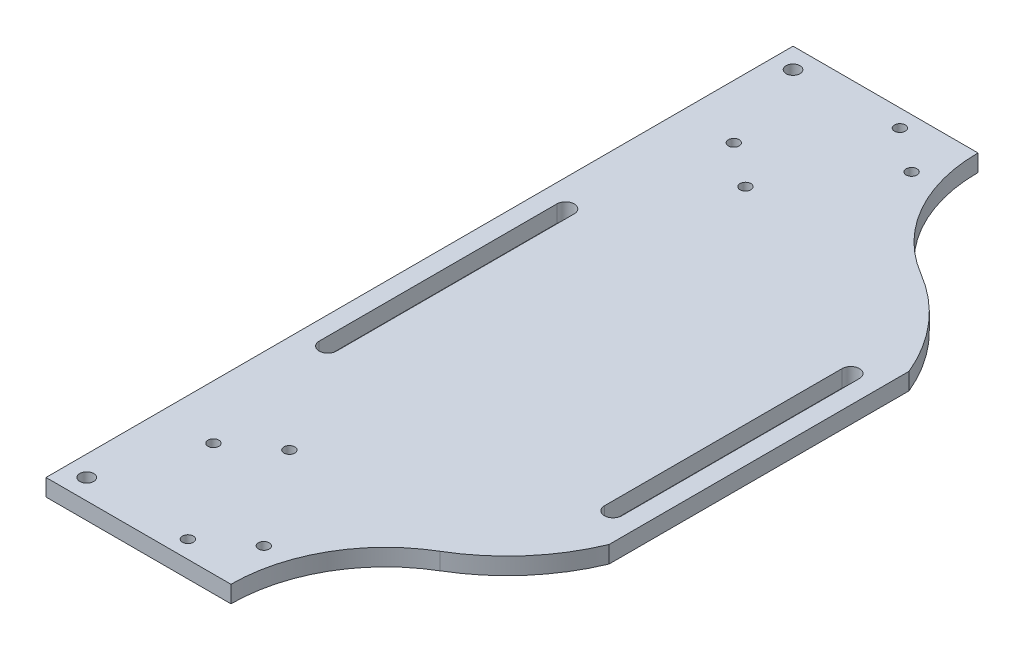
ISO-10303-21;
HEADER;
FILE_DESCRIPTION(('STEP AP214'),'2;1');
FILE_NAME('part.step','',(''),(''),'','','');
FILE_SCHEMA(('AUTOMOTIVE_DESIGN { 1 0 10303 214 1 1 1 1 }'));
ENDSEC;
DATA;
#1=APPLICATION_CONTEXT('core data for automotive mechanical design processes');
#2=APPLICATION_PROTOCOL_DEFINITION('international standard','automotive_design',2000,#1);
#3=PRODUCT_CONTEXT('',#1,'mechanical');
#4=PRODUCT('Part','Part','',(#3));
#5=PRODUCT_RELATED_PRODUCT_CATEGORY('part','',(#4));
#6=PRODUCT_DEFINITION_FORMATION('','',#4);
#7=PRODUCT_DEFINITION_CONTEXT('part definition',#1,'design');
#8=PRODUCT_DEFINITION('design','',#6,#7);
#9=PRODUCT_DEFINITION_SHAPE('','',#8);
#10=(LENGTH_UNIT() NAMED_UNIT(*) SI_UNIT(.MILLI.,.METRE.));
#11=(NAMED_UNIT(*) PLANE_ANGLE_UNIT() SI_UNIT($,.RADIAN.));
#12=(NAMED_UNIT(*) SI_UNIT($,.STERADIAN.) SOLID_ANGLE_UNIT());
#13=UNCERTAINTY_MEASURE_WITH_UNIT(LENGTH_MEASURE(1.E-05),#10,'distance_accuracy_value','');
#14=(GEOMETRIC_REPRESENTATION_CONTEXT(3) GLOBAL_UNCERTAINTY_ASSIGNED_CONTEXT((#13)) GLOBAL_UNIT_ASSIGNED_CONTEXT((#10,
#11,#12)) REPRESENTATION_CONTEXT('',''));
#15=CARTESIAN_POINT('',(0.,0.,0.));
#16=DIRECTION('',(0.,0.,1.));
#17=DIRECTION('',(1.,0.,0.));
#18=AXIS2_PLACEMENT_3D('',#15,#16,#17);
#19=CARTESIAN_POINT('',(0.,5.,0.));
#20=DIRECTION('',(0.,1.,0.));
#21=DIRECTION('',(0.,0.,1.));
#22=AXIS2_PLACEMENT_3D('',#19,#20,#21);
#23=PLANE('',#22);
#24=CARTESIAN_POINT('',(-1.59043539274804,5.,-22.6766971675435));
#25=DIRECTION('',(0.,-1.,0.));
#26=DIRECTION('',(0.,0.,-1.));
#27=AXIS2_PLACEMENT_3D('',#24,#25,#26);
#28=CIRCLE('',#27,55.8907274632713);
#29=CARTESIAN_POINT('',(26.8388547492282,5.,-70.7968476078424));
#30=VERTEX_POINT('',#29);
#31=CARTESIAN_POINT('',(50.,5.,-44.1755434705514));
#32=VERTEX_POINT('',#31);
#33=EDGE_CURVE('E171',#30,#32,#28,.T.);
#34=ORIENTED_EDGE('',*,*,#33,.F.);
#35=CARTESIAN_POINT('',(50.,5.,-110.));
#36=DIRECTION('',(0.,1.,0.));
#37=DIRECTION('',(0.,0.,1.));
#38=AXIS2_PLACEMENT_3D('',#35,#36,#37);
#39=CIRCLE('',#38,45.5337875298122);
#40=CARTESIAN_POINT('',(4.46621247018783,5.,-110.));
#41=VERTEX_POINT('',#40);
#42=EDGE_CURVE('E158',#41,#30,#39,.T.);
#43=ORIENTED_EDGE('',*,*,#42,.F.);
#44=DIRECTION('',(-1.,0.,0.));
#45=VECTOR('',#44,1.);
#46=CARTESIAN_POINT('',(50.,5.,-110.));
#47=LINE('',#46,#45);
#48=CARTESIAN_POINT('',(-50.,5.,-110.));
#49=VERTEX_POINT('',#48);
#50=EDGE_CURVE('E168',#41,#49,#47,.T.);
#51=ORIENTED_EDGE('',*,*,#50,.T.);
#52=DIRECTION('',(0.,0.,1.));
#53=VECTOR('',#52,1.);
#54=CARTESIAN_POINT('',(-50.,5.,110.));
#55=LINE('',#54,#53);
#56=CARTESIAN_POINT('',(-50.,5.,110.));
#57=VERTEX_POINT('',#56);
#58=EDGE_CURVE('E204',#49,#57,#55,.T.);
#59=ORIENTED_EDGE('',*,*,#58,.T.);
#60=DIRECTION('',(1.,0.,0.));
#61=VECTOR('',#60,1.);
#62=CARTESIAN_POINT('',(50.,5.,110.));
#63=LINE('',#62,#61);
#64=CARTESIAN_POINT('',(4.46621247018783,5.,110.));
#65=VERTEX_POINT('',#64);
#66=EDGE_CURVE('E185',#57,#65,#63,.T.);
#67=ORIENTED_EDGE('',*,*,#66,.T.);
#68=CARTESIAN_POINT('',(50.,5.,110.));
#69=DIRECTION('',(0.,1.,0.));
#70=DIRECTION('',(0.,0.,-1.));
#71=AXIS2_PLACEMENT_3D('',#68,#69,#70);
#72=CIRCLE('',#71,45.5337875298122);
#73=CARTESIAN_POINT('',(26.8388547492282,5.,70.7968476078424));
#74=VERTEX_POINT('',#73);
#75=EDGE_CURVE('E173',#74,#65,#72,.T.);
#76=ORIENTED_EDGE('',*,*,#75,.F.);
#77=CARTESIAN_POINT('',(-1.59043539274804,5.,22.6766971675435));
#78=DIRECTION('',(0.,-1.,0.));
#79=DIRECTION('',(0.,0.,1.));
#80=AXIS2_PLACEMENT_3D('',#77,#78,#79);
#81=CIRCLE('',#80,55.8907274632713);
#82=CARTESIAN_POINT('',(50.,5.,44.1755434705514));
#83=VERTEX_POINT('',#82);
#84=EDGE_CURVE('E400',#83,#74,#81,.T.);
#85=ORIENTED_EDGE('',*,*,#84,.F.);
#86=DIRECTION('',(0.,0.,-1.));
#87=VECTOR('',#86,1.);
#88=CARTESIAN_POINT('',(50.,5.,110.));
#89=LINE('',#88,#87);
#90=EDGE_CURVE('E180',#83,#32,#89,.T.);
#91=ORIENTED_EDGE('',*,*,#90,.T.);
#92=EDGE_LOOP('',(#34,#43,#51,#59,#67,#76,#85,#91));
#93=FACE_BOUND('',#92,.T.);
#94=CARTESIAN_POINT('',(-44.,5.,104.));
#95=DIRECTION('',(0.,1.,0.));
#96=DIRECTION('',(0.,0.,-1.));
#97=AXIS2_PLACEMENT_3D('',#94,#95,#96);
#98=CIRCLE('',#97,2.04999999999999);
#99=CARTESIAN_POINT('',(-44.,5.,101.95));
#100=VERTEX_POINT('',#99);
#101=EDGE_CURVE('E282',#100,#100,#98,.T.);
#102=ORIENTED_EDGE('',*,*,#101,.F.);
#103=EDGE_LOOP('',(#102));
#104=FACE_BOUND('',#103,.T.);
#105=CARTESIAN_POINT('',(-21.1703514193632,5.,67.157003263505));
#106=DIRECTION('',(0.,1.,0.));
#107=DIRECTION('',(0.,0.,-1.));
#108=AXIS2_PLACEMENT_3D('',#105,#106,#107);
#109=CIRCLE('',#108,1.60000000000001);
#110=CARTESIAN_POINT('',(-21.1703514193632,5.,65.557003263505));
#111=VERTEX_POINT('',#110);
#112=EDGE_CURVE('E298',#111,#111,#109,.T.);
#113=ORIENTED_EDGE('',*,*,#112,.F.);
#114=EDGE_LOOP('',(#113));
#115=FACE_BOUND('',#114,.T.);
#116=CARTESIAN_POINT('',(-21.1703514193632,5.,-67.157003263505));
#117=DIRECTION('',(0.,1.,0.));
#118=DIRECTION('',(0.,0.,1.));
#119=AXIS2_PLACEMENT_3D('',#116,#117,#118);
#120=CIRCLE('',#119,1.60000000000001);
#121=CARTESIAN_POINT('',(-21.1703514193632,5.,-65.557003263505));
#122=VERTEX_POINT('',#121);
#123=EDGE_CURVE('E314',#122,#122,#120,.T.);
#124=ORIENTED_EDGE('',*,*,#123,.F.);
#125=EDGE_LOOP('',(#124));
#126=FACE_BOUND('',#125,.T.);
#127=CARTESIAN_POINT('',(-34.0728313530545,5.,-76.6188218815453));
#128=DIRECTION('',(0.,1.,0.));
#129=DIRECTION('',(0.,0.,1.));
#130=AXIS2_PLACEMENT_3D('',#127,#128,#129);
#131=CIRCLE('',#130,1.6);
#132=CARTESIAN_POINT('',(-34.0728313530545,5.,-75.0188218815453));
#133=VERTEX_POINT('',#132);
#134=EDGE_CURVE('E330',#133,#133,#131,.T.);
#135=ORIENTED_EDGE('',*,*,#134,.F.);
#136=EDGE_LOOP('',(#135));
#137=FACE_BOUND('',#136,.T.);
#138=CARTESIAN_POINT('',(-44.,5.,-104.));
#139=DIRECTION('',(0.,1.,0.));
#140=DIRECTION('',(0.,0.,1.));
#141=AXIS2_PLACEMENT_3D('',#138,#139,#140);
#142=CIRCLE('',#141,2.04999999999999);
#143=CARTESIAN_POINT('',(-44.,5.,-101.95));
#144=VERTEX_POINT('',#143);
#145=EDGE_CURVE('E346',#144,#144,#142,.T.);
#146=ORIENTED_EDGE('',*,*,#145,.F.);
#147=EDGE_LOOP('',(#146));
#148=FACE_BOUND('',#147,.T.);
#149=DIRECTION('',(0.,0.,-1.));
#150=VECTOR('',#149,1.);
#151=CARTESIAN_POINT('',(44.55,5.,35.));
#152=LINE('',#151,#150);
#153=CARTESIAN_POINT('',(44.55,5.,35.));
#154=VERTEX_POINT('',#153);
#155=CARTESIAN_POINT('',(44.55,5.,-35.));
#156=VERTEX_POINT('',#155);
#157=EDGE_CURVE('E357',#154,#156,#152,.T.);
#158=ORIENTED_EDGE('',*,*,#157,.F.);
#159=CARTESIAN_POINT('',(42.,5.,35.));
#160=DIRECTION('',(0.,1.,0.));
#161=DIRECTION('',(0.,0.,1.));
#162=AXIS2_PLACEMENT_3D('',#159,#160,#161);
#163=CIRCLE('',#162,2.55000000000001);
#164=CARTESIAN_POINT('',(39.45,5.,35.));
#165=VERTEX_POINT('',#164);
#166=EDGE_CURVE('E354',#165,#154,#163,.T.);
#167=ORIENTED_EDGE('',*,*,#166,.F.);
#168=DIRECTION('',(0.,0.,1.));
#169=VECTOR('',#168,1.);
#170=CARTESIAN_POINT('',(39.45,5.,35.));
#171=LINE('',#170,#169);
#172=CARTESIAN_POINT('',(39.45,5.,-35.));
#173=VERTEX_POINT('',#172);
#174=EDGE_CURVE('E365',#173,#165,#171,.T.);
#175=ORIENTED_EDGE('',*,*,#174,.F.);
#176=CARTESIAN_POINT('',(42.,5.,-35.));
#177=DIRECTION('',(0.,1.,0.));
#178=DIRECTION('',(0.,0.,1.));
#179=AXIS2_PLACEMENT_3D('',#176,#177,#178);
#180=CIRCLE('',#179,2.55000000000001);
#181=EDGE_CURVE('E361',#156,#173,#180,.T.);
#182=ORIENTED_EDGE('',*,*,#181,.F.);
#183=EDGE_LOOP('',(#158,#167,#175,#182));
#184=FACE_BOUND('',#183,.T.);
#185=CARTESIAN_POINT('',(-0.472623192400063,5.,-95.3811781184547));
#186=DIRECTION('',(0.,1.,0.));
#187=DIRECTION('',(0.,0.,1.));
#188=AXIS2_PLACEMENT_3D('',#185,#186,#187);
#189=CIRCLE('',#188,1.60000000000001);
#190=CARTESIAN_POINT('',(-0.472623192400063,5.,-93.7811781184547));
#191=VERTEX_POINT('',#190);
#192=EDGE_CURVE('E338',#191,#191,#189,.T.);
#193=ORIENTED_EDGE('',*,*,#192,.F.);
#194=EDGE_LOOP('',(#193));
#195=FACE_BOUND('',#194,.T.);
#196=CARTESIAN_POINT('',(-0.472623192400063,5.,95.3811781184547));
#197=DIRECTION('',(0.,1.,0.));
#198=DIRECTION('',(0.,0.,-1.));
#199=AXIS2_PLACEMENT_3D('',#196,#197,#198);
#200=CIRCLE('',#199,1.60000000000001);
#201=CARTESIAN_POINT('',(-0.472623192400063,5.,93.7811781184547));
#202=VERTEX_POINT('',#201);
#203=EDGE_CURVE('E322',#202,#202,#200,.T.);
#204=ORIENTED_EDGE('',*,*,#203,.F.);
#205=EDGE_LOOP('',(#204));
#206=FACE_BOUND('',#205,.T.);
#207=CARTESIAN_POINT('',(-13.3751031260914,5.,-104.842996736495));
#208=DIRECTION('',(0.,1.,0.));
#209=DIRECTION('',(0.,0.,1.));
#210=AXIS2_PLACEMENT_3D('',#207,#208,#209);
#211=CIRCLE('',#210,1.60000000000001);
#212=CARTESIAN_POINT('',(-13.3751031260914,5.,-103.242996736495));
#213=VERTEX_POINT('',#212);
#214=EDGE_CURVE('E306',#213,#213,#211,.T.);
#215=ORIENTED_EDGE('',*,*,#214,.F.);
#216=EDGE_LOOP('',(#215));
#217=FACE_BOUND('',#216,.T.);
#218=CARTESIAN_POINT('',(-34.0728313530545,5.,76.6188218815453));
#219=DIRECTION('',(0.,1.,0.));
#220=DIRECTION('',(0.,0.,-1.));
#221=AXIS2_PLACEMENT_3D('',#218,#219,#220);
#222=CIRCLE('',#221,1.6);
#223=CARTESIAN_POINT('',(-34.0728313530545,5.,75.0188218815453));
#224=VERTEX_POINT('',#223);
#225=EDGE_CURVE('E290',#224,#224,#222,.T.);
#226=ORIENTED_EDGE('',*,*,#225,.F.);
#227=EDGE_LOOP('',(#226));
#228=FACE_BOUND('',#227,.T.);
#229=CARTESIAN_POINT('',(-13.3751031260914,5.,104.842996736495));
#230=DIRECTION('',(0.,1.,0.));
#231=DIRECTION('',(0.,0.,-1.));
#232=AXIS2_PLACEMENT_3D('',#229,#230,#231);
#233=CIRCLE('',#232,1.60000000000001);
#234=CARTESIAN_POINT('',(-13.3751031260914,5.,103.242996736495));
#235=VERTEX_POINT('',#234);
#236=EDGE_CURVE('E274',#235,#235,#233,.T.);
#237=ORIENTED_EDGE('',*,*,#236,.F.);
#238=EDGE_LOOP('',(#237));
#239=FACE_BOUND('',#238,.T.);
#240=DIRECTION('',(0.,0.,-1.));
#241=VECTOR('',#240,1.);
#242=CARTESIAN_POINT('',(-39.45,5.,35.));
#243=LINE('',#242,#241);
#244=CARTESIAN_POINT('',(-39.45,5.,35.));
#245=VERTEX_POINT('',#244);
#246=CARTESIAN_POINT('',(-39.45,5.,-35.));
#247=VERTEX_POINT('',#246);
#248=EDGE_CURVE('E238',#245,#247,#243,.T.);
#249=ORIENTED_EDGE('',*,*,#248,.F.);
#250=CARTESIAN_POINT('',(-42.,5.,35.));
#251=DIRECTION('',(0.,1.,0.));
#252=DIRECTION('',(0.,0.,-1.));
#253=AXIS2_PLACEMENT_3D('',#250,#251,#252);
#254=CIRCLE('',#253,2.55000000000001);
#255=CARTESIAN_POINT('',(-44.55,5.,35.));
#256=VERTEX_POINT('',#255);
#257=EDGE_CURVE('E235',#256,#245,#254,.T.);
#258=ORIENTED_EDGE('',*,*,#257,.F.);
#259=DIRECTION('',(0.,0.,1.));
#260=VECTOR('',#259,1.);
#261=CARTESIAN_POINT('',(-44.55,5.,35.));
#262=LINE('',#261,#260);
#263=CARTESIAN_POINT('',(-44.55,5.,-35.));
#264=VERTEX_POINT('',#263);
#265=EDGE_CURVE('E246',#264,#256,#262,.T.);
#266=ORIENTED_EDGE('',*,*,#265,.F.);
#267=CARTESIAN_POINT('',(-42.,5.,-35.));
#268=DIRECTION('',(0.,1.,0.));
#269=DIRECTION('',(0.,0.,-1.));
#270=AXIS2_PLACEMENT_3D('',#267,#268,#269);
#271=CIRCLE('',#270,2.55000000000001);
#272=EDGE_CURVE('E242',#247,#264,#271,.T.);
#273=ORIENTED_EDGE('',*,*,#272,.F.);
#274=EDGE_LOOP('',(#249,#258,#266,#273));
#275=FACE_BOUND('',#274,.T.);
#276=ADVANCED_FACE('F43',(#93,#104,#115,#126,#137,#148,#184,#195,#206,#217,#228,#239,#275),#23,.T.);
#277=CARTESIAN_POINT('',(0.,0.,0.));
#278=DIRECTION('',(0.,1.,0.));
#279=DIRECTION('',(0.,0.,1.));
#280=AXIS2_PLACEMENT_3D('',#277,#278,#279);
#281=PLANE('',#280);
#282=CARTESIAN_POINT('',(-13.3751031260914,0.,104.842996736495));
#283=DIRECTION('',(0.,1.,0.));
#284=DIRECTION('',(0.,0.,-1.));
#285=AXIS2_PLACEMENT_3D('',#282,#283,#284);
#286=CIRCLE('',#285,1.60000000000001);
#287=CARTESIAN_POINT('',(-13.3751031260914,0.,103.242996736495));
#288=VERTEX_POINT('',#287);
#289=EDGE_CURVE('E273',#288,#288,#286,.T.);
#290=ORIENTED_EDGE('',*,*,#289,.T.);
#291=EDGE_LOOP('',(#290));
#292=FACE_BOUND('',#291,.T.);
#293=CARTESIAN_POINT('',(-44.,0.,104.));
#294=DIRECTION('',(0.,1.,0.));
#295=DIRECTION('',(0.,0.,-1.));
#296=AXIS2_PLACEMENT_3D('',#293,#294,#295);
#297=CIRCLE('',#296,2.04999999999999);
#298=CARTESIAN_POINT('',(-44.,0.,101.95));
#299=VERTEX_POINT('',#298);
#300=EDGE_CURVE('E278',#299,#299,#297,.T.);
#301=ORIENTED_EDGE('',*,*,#300,.T.);
#302=EDGE_LOOP('',(#301));
#303=FACE_BOUND('',#302,.T.);
#304=CARTESIAN_POINT('',(-34.0728313530545,0.,76.6188218815453));
#305=DIRECTION('',(0.,1.,0.));
#306=DIRECTION('',(0.,0.,-1.));
#307=AXIS2_PLACEMENT_3D('',#304,#305,#306);
#308=CIRCLE('',#307,1.6);
#309=CARTESIAN_POINT('',(-34.0728313530545,0.,75.0188218815453));
#310=VERTEX_POINT('',#309);
#311=EDGE_CURVE('E286',#310,#310,#308,.T.);
#312=ORIENTED_EDGE('',*,*,#311,.T.);
#313=EDGE_LOOP('',(#312));
#314=FACE_BOUND('',#313,.T.);
#315=CARTESIAN_POINT('',(-21.1703514193632,0.,67.157003263505));
#316=DIRECTION('',(0.,1.,0.));
#317=DIRECTION('',(0.,0.,-1.));
#318=AXIS2_PLACEMENT_3D('',#315,#316,#317);
#319=CIRCLE('',#318,1.60000000000001);
#320=CARTESIAN_POINT('',(-21.1703514193632,0.,65.557003263505));
#321=VERTEX_POINT('',#320);
#322=EDGE_CURVE('E294',#321,#321,#319,.T.);
#323=ORIENTED_EDGE('',*,*,#322,.T.);
#324=EDGE_LOOP('',(#323));
#325=FACE_BOUND('',#324,.T.);
#326=CARTESIAN_POINT('',(-13.3751031260914,0.,-104.842996736495));
#327=DIRECTION('',(0.,1.,0.));
#328=DIRECTION('',(0.,0.,1.));
#329=AXIS2_PLACEMENT_3D('',#326,#327,#328);
#330=CIRCLE('',#329,1.60000000000001);
#331=CARTESIAN_POINT('',(-13.3751031260914,0.,-103.242996736495));
#332=VERTEX_POINT('',#331);
#333=EDGE_CURVE('E302',#332,#332,#330,.T.);
#334=ORIENTED_EDGE('',*,*,#333,.T.);
#335=EDGE_LOOP('',(#334));
#336=FACE_BOUND('',#335,.T.);
#337=CARTESIAN_POINT('',(-21.1703514193632,0.,-67.157003263505));
#338=DIRECTION('',(0.,1.,0.));
#339=DIRECTION('',(0.,0.,1.));
#340=AXIS2_PLACEMENT_3D('',#337,#338,#339);
#341=CIRCLE('',#340,1.60000000000001);
#342=CARTESIAN_POINT('',(-21.1703514193632,0.,-65.557003263505));
#343=VERTEX_POINT('',#342);
#344=EDGE_CURVE('E310',#343,#343,#341,.T.);
#345=ORIENTED_EDGE('',*,*,#344,.T.);
#346=EDGE_LOOP('',(#345));
#347=FACE_BOUND('',#346,.T.);
#348=CARTESIAN_POINT('',(-0.472623192400063,0.,95.3811781184547));
#349=DIRECTION('',(0.,1.,0.));
#350=DIRECTION('',(0.,0.,-1.));
#351=AXIS2_PLACEMENT_3D('',#348,#349,#350);
#352=CIRCLE('',#351,1.60000000000001);
#353=CARTESIAN_POINT('',(-0.472623192400063,0.,93.7811781184547));
#354=VERTEX_POINT('',#353);
#355=EDGE_CURVE('E318',#354,#354,#352,.T.);
#356=ORIENTED_EDGE('',*,*,#355,.T.);
#357=EDGE_LOOP('',(#356));
#358=FACE_BOUND('',#357,.T.);
#359=CARTESIAN_POINT('',(-34.0728313530545,0.,-76.6188218815453));
#360=DIRECTION('',(0.,1.,0.));
#361=DIRECTION('',(0.,0.,1.));
#362=AXIS2_PLACEMENT_3D('',#359,#360,#361);
#363=CIRCLE('',#362,1.6);
#364=CARTESIAN_POINT('',(-34.0728313530545,0.,-75.0188218815453));
#365=VERTEX_POINT('',#364);
#366=EDGE_CURVE('E326',#365,#365,#363,.T.);
#367=ORIENTED_EDGE('',*,*,#366,.T.);
#368=EDGE_LOOP('',(#367));
#369=FACE_BOUND('',#368,.T.);
#370=CARTESIAN_POINT('',(-0.472623192400063,0.,-95.3811781184547));
#371=DIRECTION('',(0.,1.,0.));
#372=DIRECTION('',(0.,0.,1.));
#373=AXIS2_PLACEMENT_3D('',#370,#371,#372);
#374=CIRCLE('',#373,1.60000000000001);
#375=CARTESIAN_POINT('',(-0.472623192400063,0.,-93.7811781184547));
#376=VERTEX_POINT('',#375);
#377=EDGE_CURVE('E334',#376,#376,#374,.T.);
#378=ORIENTED_EDGE('',*,*,#377,.T.);
#379=EDGE_LOOP('',(#378));
#380=FACE_BOUND('',#379,.T.);
#381=CARTESIAN_POINT('',(-44.,0.,-104.));
#382=DIRECTION('',(0.,1.,0.));
#383=DIRECTION('',(0.,0.,1.));
#384=AXIS2_PLACEMENT_3D('',#381,#382,#383);
#385=CIRCLE('',#384,2.04999999999999);
#386=CARTESIAN_POINT('',(-44.,0.,-101.95));
#387=VERTEX_POINT('',#386);
#388=EDGE_CURVE('E342',#387,#387,#385,.T.);
#389=ORIENTED_EDGE('',*,*,#388,.T.);
#390=EDGE_LOOP('',(#389));
#391=FACE_BOUND('',#390,.T.);
#392=CARTESIAN_POINT('',(42.,0.,35.));
#393=DIRECTION('',(0.,1.,0.));
#394=DIRECTION('',(0.,0.,1.));
#395=AXIS2_PLACEMENT_3D('',#392,#393,#394);
#396=CIRCLE('',#395,2.55000000000001);
#397=CARTESIAN_POINT('',(39.45,0.,35.));
#398=VERTEX_POINT('',#397);
#399=CARTESIAN_POINT('',(44.55,0.,35.));
#400=VERTEX_POINT('',#399);
#401=EDGE_CURVE('E350',#398,#400,#396,.T.);
#402=ORIENTED_EDGE('',*,*,#401,.T.);
#403=DIRECTION('',(0.,0.,-1.));
#404=VECTOR('',#403,1.);
#405=CARTESIAN_POINT('',(44.55,0.,35.));
#406=LINE('',#405,#404);
#407=CARTESIAN_POINT('',(44.55,0.,-35.));
#408=VERTEX_POINT('',#407);
#409=EDGE_CURVE('E372',#400,#408,#406,.T.);
#410=ORIENTED_EDGE('',*,*,#409,.T.);
#411=CARTESIAN_POINT('',(42.,0.,-35.));
#412=DIRECTION('',(0.,1.,0.));
#413=DIRECTION('',(0.,0.,1.));
#414=AXIS2_PLACEMENT_3D('',#411,#412,#413);
#415=CIRCLE('',#414,2.55000000000001);
#416=CARTESIAN_POINT('',(39.45,0.,-35.));
#417=VERTEX_POINT('',#416);
#418=EDGE_CURVE('E376',#408,#417,#415,.T.);
#419=ORIENTED_EDGE('',*,*,#418,.T.);
#420=DIRECTION('',(0.,0.,1.));
#421=VECTOR('',#420,1.);
#422=CARTESIAN_POINT('',(39.45,0.,35.));
#423=LINE('',#422,#421);
#424=EDGE_CURVE('E358',#417,#398,#423,.T.);
#425=ORIENTED_EDGE('',*,*,#424,.T.);
#426=EDGE_LOOP('',(#402,#410,#419,#425));
#427=FACE_BOUND('',#426,.T.);
#428=CARTESIAN_POINT('',(50.,0.,-110.));
#429=DIRECTION('',(0.,1.,0.));
#430=DIRECTION('',(0.,0.,1.));
#431=AXIS2_PLACEMENT_3D('',#428,#429,#430);
#432=CIRCLE('',#431,45.5337875298122);
#433=CARTESIAN_POINT('',(4.46621247018782,0.,-110.));
#434=VERTEX_POINT('',#433);
#435=CARTESIAN_POINT('',(26.8388547492282,0.,-70.7968476078424));
#436=VERTEX_POINT('',#435);
#437=EDGE_CURVE('E66',#434,#436,#432,.T.);
#438=ORIENTED_EDGE('',*,*,#437,.T.);
#439=CARTESIAN_POINT('',(-1.59043539274804,0.,-22.6766971675435));
#440=DIRECTION('',(0.,1.,0.));
#441=DIRECTION('',(0.,0.,1.));
#442=AXIS2_PLACEMENT_3D('',#439,#440,#441);
#443=CIRCLE('',#442,55.8907274632713);
#444=CARTESIAN_POINT('',(50.,0.,-44.1755434705514));
#445=VERTEX_POINT('',#444);
#446=EDGE_CURVE('E224',#436,#445,#443,.F.);
#447=ORIENTED_EDGE('',*,*,#446,.T.);
#448=DIRECTION('',(0.,0.,-1.));
#449=VECTOR('',#448,1.);
#450=CARTESIAN_POINT('',(50.,0.,110.));
#451=LINE('',#450,#449);
#452=CARTESIAN_POINT('',(50.,0.,44.1755434705514));
#453=VERTEX_POINT('',#452);
#454=EDGE_CURVE('E198',#453,#445,#451,.T.);
#455=ORIENTED_EDGE('',*,*,#454,.F.);
#456=CARTESIAN_POINT('',(-1.59043539274804,0.,22.6766971675435));
#457=DIRECTION('',(0.,1.,0.));
#458=DIRECTION('',(0.,0.,1.));
#459=AXIS2_PLACEMENT_3D('',#456,#457,#458);
#460=CIRCLE('',#459,55.8907274632713);
#461=CARTESIAN_POINT('',(26.8388547492282,0.,70.7968476078424));
#462=VERTEX_POINT('',#461);
#463=EDGE_CURVE('E59',#453,#462,#460,.F.);
#464=ORIENTED_EDGE('',*,*,#463,.T.);
#465=CARTESIAN_POINT('',(50.,0.,110.));
#466=DIRECTION('',(0.,1.,0.));
#467=DIRECTION('',(0.,0.,1.));
#468=AXIS2_PLACEMENT_3D('',#465,#466,#467);
#469=CIRCLE('',#468,45.5337875298122);
#470=CARTESIAN_POINT('',(4.46621247018783,0.,110.));
#471=VERTEX_POINT('',#470);
#472=EDGE_CURVE('E219',#462,#471,#469,.T.);
#473=ORIENTED_EDGE('',*,*,#472,.T.);
#474=DIRECTION('',(1.,0.,0.));
#475=VECTOR('',#474,1.);
#476=CARTESIAN_POINT('',(50.,0.,110.));
#477=LINE('',#476,#475);
#478=CARTESIAN_POINT('',(-50.,0.,110.));
#479=VERTEX_POINT('',#478);
#480=EDGE_CURVE('E193',#479,#471,#477,.T.);
#481=ORIENTED_EDGE('',*,*,#480,.F.);
#482=DIRECTION('',(0.,0.,1.));
#483=VECTOR('',#482,1.);
#484=CARTESIAN_POINT('',(-50.,0.,110.));
#485=LINE('',#484,#483);
#486=CARTESIAN_POINT('',(-50.,0.,-110.));
#487=VERTEX_POINT('',#486);
#488=EDGE_CURVE('E189',#487,#479,#485,.T.);
#489=ORIENTED_EDGE('',*,*,#488,.F.);
#490=DIRECTION('',(-1.,0.,0.));
#491=VECTOR('',#490,1.);
#492=CARTESIAN_POINT('',(50.,0.,-110.));
#493=LINE('',#492,#491);
#494=EDGE_CURVE('E202',#434,#487,#493,.T.);
#495=ORIENTED_EDGE('',*,*,#494,.F.);
#496=EDGE_LOOP('',(#438,#447,#455,#464,#473,#481,#489,#495));
#497=FACE_BOUND('',#496,.T.);
#498=CARTESIAN_POINT('',(-42.,0.,35.));
#499=DIRECTION('',(0.,1.,0.));
#500=DIRECTION('',(0.,0.,-1.));
#501=AXIS2_PLACEMENT_3D('',#498,#499,#500);
#502=CIRCLE('',#501,2.55000000000001);
#503=CARTESIAN_POINT('',(-44.55,0.,35.));
#504=VERTEX_POINT('',#503);
#505=CARTESIAN_POINT('',(-39.45,0.,35.));
#506=VERTEX_POINT('',#505);
#507=EDGE_CURVE('E223',#504,#506,#502,.T.);
#508=ORIENTED_EDGE('',*,*,#507,.T.);
#509=DIRECTION('',(0.,0.,-1.));
#510=VECTOR('',#509,1.);
#511=CARTESIAN_POINT('',(-39.45,0.,35.));
#512=LINE('',#511,#510);
#513=CARTESIAN_POINT('',(-39.45,0.,-35.));
#514=VERTEX_POINT('',#513);
#515=EDGE_CURVE('E229',#506,#514,#512,.T.);
#516=ORIENTED_EDGE('',*,*,#515,.T.);
#517=CARTESIAN_POINT('',(-42.,0.,-35.));
#518=DIRECTION('',(0.,1.,0.));
#519=DIRECTION('',(0.,0.,-1.));
#520=AXIS2_PLACEMENT_3D('',#517,#518,#519);
#521=CIRCLE('',#520,2.55000000000001);
#522=CARTESIAN_POINT('',(-44.55,0.,-35.));
#523=VERTEX_POINT('',#522);
#524=EDGE_CURVE('E253',#514,#523,#521,.T.);
#525=ORIENTED_EDGE('',*,*,#524,.T.);
#526=DIRECTION('',(0.,0.,1.));
#527=VECTOR('',#526,1.);
#528=CARTESIAN_POINT('',(-44.55,0.,35.));
#529=LINE('',#528,#527);
#530=EDGE_CURVE('E239',#523,#504,#529,.T.);
#531=ORIENTED_EDGE('',*,*,#530,.T.);
#532=EDGE_LOOP('',(#508,#516,#525,#531));
#533=FACE_BOUND('',#532,.T.);
#534=ADVANCED_FACE('F216',(#292,#303,#314,#325,#336,#347,#358,#369,#380,#391,#427,#497,#533),
#281,.F.);
#535=CARTESIAN_POINT('',(-50.,5.,110.));
#536=DIRECTION('',(1.,0.,0.));
#537=DIRECTION('',(0.,0.,-1.));
#538=AXIS2_PLACEMENT_3D('',#535,#536,#537);
#539=PLANE('',#538);
#540=ORIENTED_EDGE('',*,*,#488,.T.);
#541=DIRECTION('',(0.,-1.,0.));
#542=VECTOR('',#541,1.);
#543=CARTESIAN_POINT('',(-50.,5.,110.));
#544=LINE('',#543,#542);
#545=EDGE_CURVE('E164',#57,#479,#544,.T.);
#546=ORIENTED_EDGE('',*,*,#545,.F.);
#547=ORIENTED_EDGE('',*,*,#58,.F.);
#548=DIRECTION('',(0.,-1.,0.));
#549=VECTOR('',#548,1.);
#550=CARTESIAN_POINT('',(-50.,5.,-110.));
#551=LINE('',#550,#549);
#552=EDGE_CURVE('E177',#49,#487,#551,.T.);
#553=ORIENTED_EDGE('',*,*,#552,.T.);
#554=EDGE_LOOP('',(#540,#546,#547,#553));
#555=FACE_BOUND('',#554,.T.);
#556=ADVANCED_FACE('F45',(#555),#539,.F.);
#557=CARTESIAN_POINT('',(50.,5.,110.));
#558=DIRECTION('',(0.,0.,-1.));
#559=DIRECTION('',(-1.,0.,0.));
#560=AXIS2_PLACEMENT_3D('',#557,#558,#559);
#561=PLANE('',#560);
#562=ORIENTED_EDGE('',*,*,#480,.T.);
#563=DIRECTION('',(0.,1.,0.));
#564=VECTOR('',#563,1.);
#565=CARTESIAN_POINT('',(4.46621247018783,-5.,110.));
#566=LINE('',#565,#564);
#567=EDGE_CURVE('E405',#471,#65,#566,.T.);
#568=ORIENTED_EDGE('',*,*,#567,.T.);
#569=ORIENTED_EDGE('',*,*,#66,.F.);
#570=ORIENTED_EDGE('',*,*,#545,.T.);
#571=EDGE_LOOP('',(#562,#568,#569,#570));
#572=FACE_BOUND('',#571,.T.);
#573=ADVANCED_FACE('F210',(#572),#561,.F.);
#574=CARTESIAN_POINT('',(50.,5.,110.));
#575=DIRECTION('',(-1.,0.,0.));
#576=DIRECTION('',(0.,0.,1.));
#577=AXIS2_PLACEMENT_3D('',#574,#575,#576);
#578=PLANE('',#577);
#579=ORIENTED_EDGE('',*,*,#454,.T.);
#580=DIRECTION('',(0.,1.,0.));
#581=VECTOR('',#580,1.);
#582=CARTESIAN_POINT('',(50.,-5.,-44.1755434705514));
#583=LINE('',#582,#581);
#584=EDGE_CURVE('E410',#445,#32,#583,.T.);
#585=ORIENTED_EDGE('',*,*,#584,.T.);
#586=ORIENTED_EDGE('',*,*,#90,.F.);
#587=DIRECTION('',(0.,1.,0.));
#588=VECTOR('',#587,1.);
#589=CARTESIAN_POINT('',(50.,-5.,44.1755434705514));
#590=LINE('',#589,#588);
#591=EDGE_CURVE('E11',#83,#453,#590,.F.);
#592=ORIENTED_EDGE('',*,*,#591,.T.);
#593=EDGE_LOOP('',(#579,#585,#586,#592));
#594=FACE_BOUND('',#593,.T.);
#595=ADVANCED_FACE('F428',(#594),#578,.F.);
#596=CARTESIAN_POINT('',(50.,5.,-110.));
#597=DIRECTION('',(0.,0.,1.));
#598=DIRECTION('',(1.,0.,0.));
#599=AXIS2_PLACEMENT_3D('',#596,#597,#598);
#600=PLANE('',#599);
#601=ORIENTED_EDGE('',*,*,#50,.F.);
#602=DIRECTION('',(0.,1.,0.));
#603=VECTOR('',#602,1.);
#604=CARTESIAN_POINT('',(4.46621247018782,-5.,-110.));
#605=LINE('',#604,#603);
#606=EDGE_CURVE('E52',#41,#434,#605,.F.);
#607=ORIENTED_EDGE('',*,*,#606,.T.);
#608=ORIENTED_EDGE('',*,*,#494,.T.);
#609=ORIENTED_EDGE('',*,*,#552,.F.);
#610=EDGE_LOOP('',(#601,#607,#608,#609));
#611=FACE_BOUND('',#610,.T.);
#612=ADVANCED_FACE('F175',(#611),#600,.F.);
#613=CARTESIAN_POINT('',(42.,5.,35.));
#614=DIRECTION('',(0.,-1.,0.));
#615=DIRECTION('',(0.,0.,-1.));
#616=AXIS2_PLACEMENT_3D('',#613,#614,#615);
#617=CYLINDRICAL_SURFACE('',#616,2.55000000000001);
#618=ORIENTED_EDGE('',*,*,#401,.F.);
#619=DIRECTION('',(0.,-1.,0.));
#620=VECTOR('',#619,1.);
#621=CARTESIAN_POINT('',(39.45,5.,35.));
#622=LINE('',#621,#620);
#623=EDGE_CURVE('E368',#165,#398,#622,.T.);
#624=ORIENTED_EDGE('',*,*,#623,.F.);
#625=ORIENTED_EDGE('',*,*,#166,.T.);
#626=DIRECTION('',(0.,-1.,0.));
#627=VECTOR('',#626,1.);
#628=CARTESIAN_POINT('',(44.55,5.,35.));
#629=LINE('',#628,#627);
#630=EDGE_CURVE('E194',#154,#400,#629,.T.);
#631=ORIENTED_EDGE('',*,*,#630,.T.);
#632=EDGE_LOOP('',(#618,#624,#625,#631));
#633=FACE_BOUND('',#632,.T.);
#634=ADVANCED_FACE('F449',(#633),#617,.F.);
#635=CARTESIAN_POINT('',(44.55,5.,35.));
#636=DIRECTION('',(-1.,0.,0.));
#637=DIRECTION('',(0.,0.,1.));
#638=AXIS2_PLACEMENT_3D('',#635,#636,#637);
#639=PLANE('',#638);
#640=ORIENTED_EDGE('',*,*,#409,.F.);
#641=ORIENTED_EDGE('',*,*,#630,.F.);
#642=ORIENTED_EDGE('',*,*,#157,.T.);
#643=DIRECTION('',(0.,-1.,0.));
#644=VECTOR('',#643,1.);
#645=CARTESIAN_POINT('',(44.55,5.,-35.));
#646=LINE('',#645,#644);
#647=EDGE_CURVE('E389',#156,#408,#646,.T.);
#648=ORIENTED_EDGE('',*,*,#647,.T.);
#649=EDGE_LOOP('',(#640,#641,#642,#648));
#650=FACE_BOUND('',#649,.T.);
#651=ADVANCED_FACE('F679',(#650),#639,.T.);
#652=CARTESIAN_POINT('',(42.,5.,-35.));
#653=DIRECTION('',(0.,-1.,0.));
#654=DIRECTION('',(0.,0.,-1.));
#655=AXIS2_PLACEMENT_3D('',#652,#653,#654);
#656=CYLINDRICAL_SURFACE('',#655,2.55000000000001);
#657=ORIENTED_EDGE('',*,*,#418,.F.);
#658=ORIENTED_EDGE('',*,*,#647,.F.);
#659=ORIENTED_EDGE('',*,*,#181,.T.);
#660=DIRECTION('',(0.,-1.,0.));
#661=VECTOR('',#660,1.);
#662=CARTESIAN_POINT('',(39.45,5.,-35.));
#663=LINE('',#662,#661);
#664=EDGE_CURVE('E386',#173,#417,#663,.T.);
#665=ORIENTED_EDGE('',*,*,#664,.T.);
#666=EDGE_LOOP('',(#657,#658,#659,#665));
#667=FACE_BOUND('',#666,.T.);
#668=ADVANCED_FACE('F669',(#667),#656,.F.);
#669=CARTESIAN_POINT('',(39.45,5.,35.));
#670=DIRECTION('',(1.,0.,0.));
#671=DIRECTION('',(0.,0.,-1.));
#672=AXIS2_PLACEMENT_3D('',#669,#670,#671);
#673=PLANE('',#672);
#674=ORIENTED_EDGE('',*,*,#424,.F.);
#675=ORIENTED_EDGE('',*,*,#664,.F.);
#676=ORIENTED_EDGE('',*,*,#174,.T.);
#677=ORIENTED_EDGE('',*,*,#623,.T.);
#678=EDGE_LOOP('',(#674,#675,#676,#677));
#679=FACE_BOUND('',#678,.T.);
#680=ADVANCED_FACE('F659',(#679),#673,.T.);
#681=CARTESIAN_POINT('',(-44.,5.,-104.));
#682=DIRECTION('',(0.,-1.,0.));
#683=DIRECTION('',(0.,0.,-1.));
#684=AXIS2_PLACEMENT_3D('',#681,#682,#683);
#685=CYLINDRICAL_SURFACE('',#684,2.04999999999999);
#686=ORIENTED_EDGE('',*,*,#145,.T.);
#687=EDGE_LOOP('',(#686));
#688=FACE_BOUND('',#687,.T.);
#689=ORIENTED_EDGE('',*,*,#388,.F.);
#690=EDGE_LOOP('',(#689));
#691=FACE_BOUND('',#690,.T.);
#692=ADVANCED_FACE('F649',(#688,#691),#685,.F.);
#693=CARTESIAN_POINT('',(-0.472623192400063,5.,-95.3811781184547));
#694=DIRECTION('',(0.,-1.,0.));
#695=DIRECTION('',(0.,0.,-1.));
#696=AXIS2_PLACEMENT_3D('',#693,#694,#695);
#697=CYLINDRICAL_SURFACE('',#696,1.60000000000001);
#698=ORIENTED_EDGE('',*,*,#192,.T.);
#699=EDGE_LOOP('',(#698));
#700=FACE_BOUND('',#699,.T.);
#701=ORIENTED_EDGE('',*,*,#377,.F.);
#702=EDGE_LOOP('',(#701));
#703=FACE_BOUND('',#702,.T.);
#704=ADVANCED_FACE('F639',(#700,#703),#697,.F.);
#705=CARTESIAN_POINT('',(-34.0728313530545,5.,-76.6188218815453));
#706=DIRECTION('',(0.,-1.,0.));
#707=DIRECTION('',(0.,0.,-1.));
#708=AXIS2_PLACEMENT_3D('',#705,#706,#707);
#709=CYLINDRICAL_SURFACE('',#708,1.6);
#710=ORIENTED_EDGE('',*,*,#134,.T.);
#711=EDGE_LOOP('',(#710));
#712=FACE_BOUND('',#711,.T.);
#713=ORIENTED_EDGE('',*,*,#366,.F.);
#714=EDGE_LOOP('',(#713));
#715=FACE_BOUND('',#714,.T.);
#716=ADVANCED_FACE('F629',(#712,#715),#709,.F.);
#717=CARTESIAN_POINT('',(-0.472623192400063,5.,95.3811781184547));
#718=DIRECTION('',(0.,-1.,0.));
#719=DIRECTION('',(0.,0.,-1.));
#720=AXIS2_PLACEMENT_3D('',#717,#718,#719);
#721=CYLINDRICAL_SURFACE('',#720,1.60000000000001);
#722=ORIENTED_EDGE('',*,*,#203,.T.);
#723=EDGE_LOOP('',(#722));
#724=FACE_BOUND('',#723,.T.);
#725=ORIENTED_EDGE('',*,*,#355,.F.);
#726=EDGE_LOOP('',(#725));
#727=FACE_BOUND('',#726,.T.);
#728=ADVANCED_FACE('F619',(#724,#727),#721,.F.);
#729=CARTESIAN_POINT('',(-21.1703514193632,5.,-67.157003263505));
#730=DIRECTION('',(0.,-1.,0.));
#731=DIRECTION('',(0.,0.,-1.));
#732=AXIS2_PLACEMENT_3D('',#729,#730,#731);
#733=CYLINDRICAL_SURFACE('',#732,1.60000000000001);
#734=ORIENTED_EDGE('',*,*,#123,.T.);
#735=EDGE_LOOP('',(#734));
#736=FACE_BOUND('',#735,.T.);
#737=ORIENTED_EDGE('',*,*,#344,.F.);
#738=EDGE_LOOP('',(#737));
#739=FACE_BOUND('',#738,.T.);
#740=ADVANCED_FACE('F609',(#736,#739),#733,.F.);
#741=CARTESIAN_POINT('',(-13.3751031260914,5.,-104.842996736495));
#742=DIRECTION('',(0.,-1.,0.));
#743=DIRECTION('',(0.,0.,-1.));
#744=AXIS2_PLACEMENT_3D('',#741,#742,#743);
#745=CYLINDRICAL_SURFACE('',#744,1.60000000000001);
#746=ORIENTED_EDGE('',*,*,#214,.T.);
#747=EDGE_LOOP('',(#746));
#748=FACE_BOUND('',#747,.T.);
#749=ORIENTED_EDGE('',*,*,#333,.F.);
#750=EDGE_LOOP('',(#749));
#751=FACE_BOUND('',#750,.T.);
#752=ADVANCED_FACE('F599',(#748,#751),#745,.F.);
#753=CARTESIAN_POINT('',(-21.1703514193632,5.,67.157003263505));
#754=DIRECTION('',(0.,-1.,0.));
#755=DIRECTION('',(0.,0.,-1.));
#756=AXIS2_PLACEMENT_3D('',#753,#754,#755);
#757=CYLINDRICAL_SURFACE('',#756,1.60000000000001);
#758=ORIENTED_EDGE('',*,*,#112,.T.);
#759=EDGE_LOOP('',(#758));
#760=FACE_BOUND('',#759,.T.);
#761=ORIENTED_EDGE('',*,*,#322,.F.);
#762=EDGE_LOOP('',(#761));
#763=FACE_BOUND('',#762,.T.);
#764=ADVANCED_FACE('F589',(#760,#763),#757,.F.);
#765=CARTESIAN_POINT('',(-34.0728313530545,5.,76.6188218815453));
#766=DIRECTION('',(0.,-1.,0.));
#767=DIRECTION('',(0.,0.,-1.));
#768=AXIS2_PLACEMENT_3D('',#765,#766,#767);
#769=CYLINDRICAL_SURFACE('',#768,1.6);
#770=ORIENTED_EDGE('',*,*,#225,.T.);
#771=EDGE_LOOP('',(#770));
#772=FACE_BOUND('',#771,.T.);
#773=ORIENTED_EDGE('',*,*,#311,.F.);
#774=EDGE_LOOP('',(#773));
#775=FACE_BOUND('',#774,.T.);
#776=ADVANCED_FACE('F579',(#772,#775),#769,.F.);
#777=CARTESIAN_POINT('',(-44.,5.,104.));
#778=DIRECTION('',(0.,-1.,0.));
#779=DIRECTION('',(0.,0.,-1.));
#780=AXIS2_PLACEMENT_3D('',#777,#778,#779);
#781=CYLINDRICAL_SURFACE('',#780,2.04999999999999);
#782=ORIENTED_EDGE('',*,*,#101,.T.);
#783=EDGE_LOOP('',(#782));
#784=FACE_BOUND('',#783,.T.);
#785=ORIENTED_EDGE('',*,*,#300,.F.);
#786=EDGE_LOOP('',(#785));
#787=FACE_BOUND('',#786,.T.);
#788=ADVANCED_FACE('F569',(#784,#787),#781,.F.);
#789=CARTESIAN_POINT('',(-13.3751031260914,5.,104.842996736495));
#790=DIRECTION('',(0.,-1.,0.));
#791=DIRECTION('',(0.,0.,-1.));
#792=AXIS2_PLACEMENT_3D('',#789,#790,#791);
#793=CYLINDRICAL_SURFACE('',#792,1.60000000000001);
#794=ORIENTED_EDGE('',*,*,#236,.T.);
#795=EDGE_LOOP('',(#794));
#796=FACE_BOUND('',#795,.T.);
#797=ORIENTED_EDGE('',*,*,#289,.F.);
#798=EDGE_LOOP('',(#797));
#799=FACE_BOUND('',#798,.T.);
#800=ADVANCED_FACE('F559',(#796,#799),#793,.F.);
#801=CARTESIAN_POINT('',(-42.,5.,35.));
#802=DIRECTION('',(0.,-1.,0.));
#803=DIRECTION('',(0.,0.,-1.));
#804=AXIS2_PLACEMENT_3D('',#801,#802,#803);
#805=CYLINDRICAL_SURFACE('',#804,2.55000000000001);
#806=ORIENTED_EDGE('',*,*,#507,.F.);
#807=DIRECTION('',(0.,-1.,0.));
#808=VECTOR('',#807,1.);
#809=CARTESIAN_POINT('',(-44.55,5.,35.));
#810=LINE('',#809,#808);
#811=EDGE_CURVE('E248',#256,#504,#810,.T.);
#812=ORIENTED_EDGE('',*,*,#811,.F.);
#813=ORIENTED_EDGE('',*,*,#257,.T.);
#814=DIRECTION('',(0.,-1.,0.));
#815=VECTOR('',#814,1.);
#816=CARTESIAN_POINT('',(-39.45,5.,35.));
#817=LINE('',#816,#815);
#818=EDGE_CURVE('E269',#245,#506,#817,.T.);
#819=ORIENTED_EDGE('',*,*,#818,.T.);
#820=EDGE_LOOP('',(#806,#812,#813,#819));
#821=FACE_BOUND('',#820,.T.);
#822=ADVANCED_FACE('F549',(#821),#805,.F.);
#823=CARTESIAN_POINT('',(-39.45,5.,35.));
#824=DIRECTION('',(-1.,0.,0.));
#825=DIRECTION('',(0.,0.,1.));
#826=AXIS2_PLACEMENT_3D('',#823,#824,#825);
#827=PLANE('',#826);
#828=ORIENTED_EDGE('',*,*,#515,.F.);
#829=ORIENTED_EDGE('',*,*,#818,.F.);
#830=ORIENTED_EDGE('',*,*,#248,.T.);
#831=DIRECTION('',(0.,-1.,0.));
#832=VECTOR('',#831,1.);
#833=CARTESIAN_POINT('',(-39.45,5.,-35.));
#834=LINE('',#833,#832);
#835=EDGE_CURVE('E266',#247,#514,#834,.T.);
#836=ORIENTED_EDGE('',*,*,#835,.T.);
#837=EDGE_LOOP('',(#828,#829,#830,#836));
#838=FACE_BOUND('',#837,.T.);
#839=ADVANCED_FACE('F539',(#838),#827,.T.);
#840=CARTESIAN_POINT('',(-42.,5.,-35.));
#841=DIRECTION('',(0.,-1.,0.));
#842=DIRECTION('',(0.,0.,-1.));
#843=AXIS2_PLACEMENT_3D('',#840,#841,#842);
#844=CYLINDRICAL_SURFACE('',#843,2.55000000000001);
#845=ORIENTED_EDGE('',*,*,#524,.F.);
#846=ORIENTED_EDGE('',*,*,#835,.F.);
#847=ORIENTED_EDGE('',*,*,#272,.T.);
#848=DIRECTION('',(0.,-1.,0.));
#849=VECTOR('',#848,1.);
#850=CARTESIAN_POINT('',(-44.55,5.,-35.));
#851=LINE('',#850,#849);
#852=EDGE_CURVE('E263',#264,#523,#851,.T.);
#853=ORIENTED_EDGE('',*,*,#852,.T.);
#854=EDGE_LOOP('',(#845,#846,#847,#853));
#855=FACE_BOUND('',#854,.T.);
#856=ADVANCED_FACE('F438',(#855),#844,.F.);
#857=CARTESIAN_POINT('',(-44.55,5.,35.));
#858=DIRECTION('',(1.,0.,0.));
#859=DIRECTION('',(0.,0.,-1.));
#860=AXIS2_PLACEMENT_3D('',#857,#858,#859);
#861=PLANE('',#860);
#862=ORIENTED_EDGE('',*,*,#530,.F.);
#863=ORIENTED_EDGE('',*,*,#852,.F.);
#864=ORIENTED_EDGE('',*,*,#265,.T.);
#865=ORIENTED_EDGE('',*,*,#811,.T.);
#866=EDGE_LOOP('',(#862,#863,#864,#865));
#867=FACE_BOUND('',#866,.T.);
#868=ADVANCED_FACE('F431',(#867),#861,.T.);
#869=CARTESIAN_POINT('',(-1.59043539274804,-5.,-22.6766971675435));
#870=DIRECTION('',(0.,1.,0.));
#871=DIRECTION('',(0.,0.,1.));
#872=AXIS2_PLACEMENT_3D('',#869,#870,#871);
#873=CYLINDRICAL_SURFACE('',#872,55.8907274632713);
#874=DIRECTION('',(0.,1.,0.));
#875=VECTOR('',#874,1.);
#876=CARTESIAN_POINT('',(26.8388547492282,-5.,-70.7968476078424));
#877=LINE('',#876,#875);
#878=EDGE_CURVE('E415',#436,#30,#877,.T.);
#879=ORIENTED_EDGE('',*,*,#878,.T.);
#880=ORIENTED_EDGE('',*,*,#33,.T.);
#881=ORIENTED_EDGE('',*,*,#584,.F.);
#882=ORIENTED_EDGE('',*,*,#446,.F.);
#883=EDGE_LOOP('',(#879,#880,#881,#882));
#884=FACE_BOUND('',#883,.T.);
#885=ADVANCED_FACE('F429',(#884),#873,.T.);
#886=CARTESIAN_POINT('',(50.,-5.,-110.));
#887=DIRECTION('',(0.,1.,0.));
#888=DIRECTION('',(0.,0.,1.));
#889=AXIS2_PLACEMENT_3D('',#886,#887,#888);
#890=CYLINDRICAL_SURFACE('',#889,45.5337875298122);
#891=ORIENTED_EDGE('',*,*,#606,.F.);
#892=ORIENTED_EDGE('',*,*,#42,.T.);
#893=ORIENTED_EDGE('',*,*,#878,.F.);
#894=ORIENTED_EDGE('',*,*,#437,.F.);
#895=EDGE_LOOP('',(#891,#892,#893,#894));
#896=FACE_BOUND('',#895,.T.);
#897=ADVANCED_FACE('F157',(#896),#890,.F.);
#898=CARTESIAN_POINT('',(50.,-5.,110.));
#899=DIRECTION('',(0.,1.,0.));
#900=DIRECTION('',(0.,0.,1.));
#901=AXIS2_PLACEMENT_3D('',#898,#899,#900);
#902=CYLINDRICAL_SURFACE('',#901,45.5337875298122);
#903=DIRECTION('',(0.,1.,0.));
#904=VECTOR('',#903,1.);
#905=CARTESIAN_POINT('',(26.8388547492282,-5.,70.7968476078424));
#906=LINE('',#905,#904);
#907=EDGE_CURVE('E423',#462,#74,#906,.T.);
#908=ORIENTED_EDGE('',*,*,#907,.T.);
#909=ORIENTED_EDGE('',*,*,#75,.T.);
#910=ORIENTED_EDGE('',*,*,#567,.F.);
#911=ORIENTED_EDGE('',*,*,#472,.F.);
#912=EDGE_LOOP('',(#908,#909,#910,#911));
#913=FACE_BOUND('',#912,.T.);
#914=ADVANCED_FACE('F425',(#913),#902,.F.);
#915=CARTESIAN_POINT('',(-1.59043539274804,-5.,22.6766971675435));
#916=DIRECTION('',(0.,1.,0.));
#917=DIRECTION('',(0.,0.,1.));
#918=AXIS2_PLACEMENT_3D('',#915,#916,#917);
#919=CYLINDRICAL_SURFACE('',#918,55.8907274632713);
#920=ORIENTED_EDGE('',*,*,#591,.F.);
#921=ORIENTED_EDGE('',*,*,#84,.T.);
#922=ORIENTED_EDGE('',*,*,#907,.F.);
#923=ORIENTED_EDGE('',*,*,#463,.F.);
#924=EDGE_LOOP('',(#920,#921,#922,#923));
#925=FACE_BOUND('',#924,.T.);
#926=ADVANCED_FACE('F426',(#925),#919,.T.);
#927=CLOSED_SHELL('',(#276,#534,#556,#573,#595,#612,#634,#651,#668,#680,#692,#704,#716,#728,
#740,#752,#764,#776,#788,#800,#822,#839,#856,#868,#885,#897,#914,#926));
#928=MANIFOLD_SOLID_BREP('B2',#927);
#929=ADVANCED_BREP_SHAPE_REPRESENTATION('',(#18,#928),#14);
#930=SHAPE_DEFINITION_REPRESENTATION(#9,#929);
ENDSEC;
END-ISO-10303-21;
